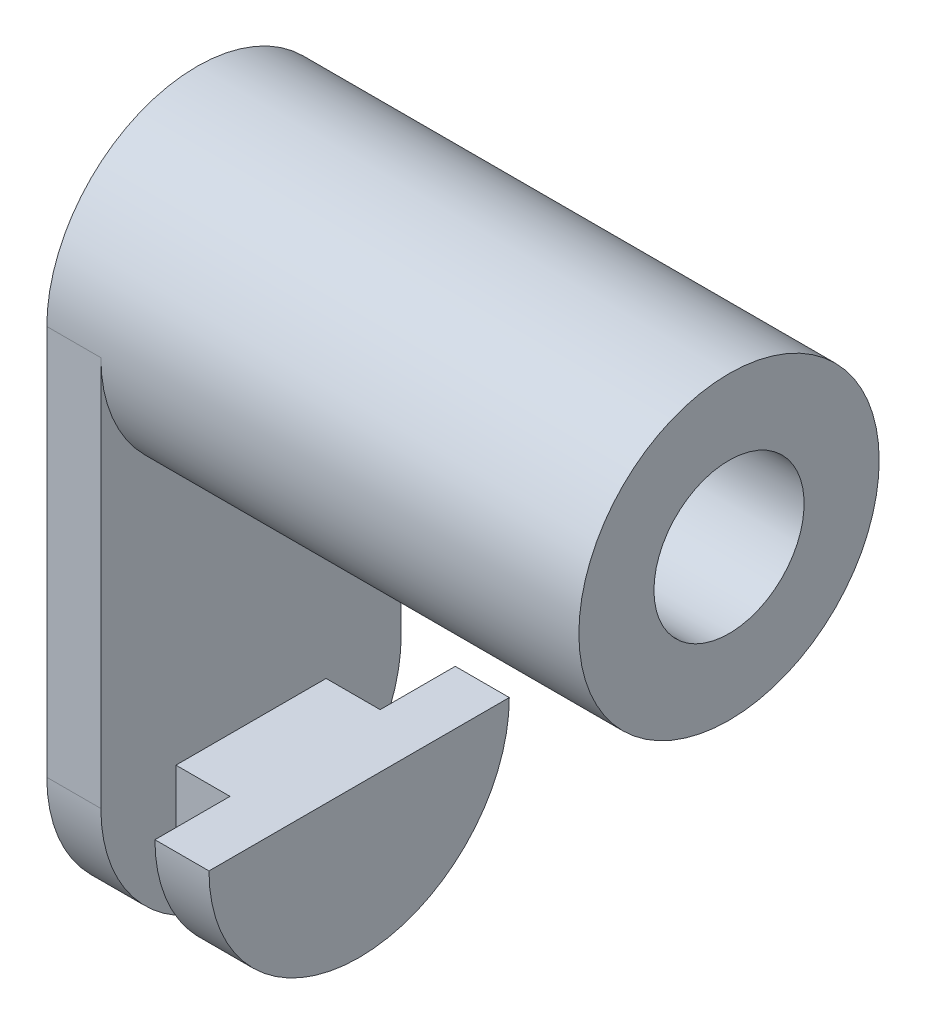
ISO-10303-21;
HEADER;
FILE_DESCRIPTION(('STEP AP214'),'2;1');
FILE_NAME('part.step','',(''),(''),'','','');
FILE_SCHEMA(('AUTOMOTIVE_DESIGN { 1 0 10303 214 1 1 1 1 }'));
ENDSEC;
DATA;
#1=APPLICATION_CONTEXT('core data for automotive mechanical design processes');
#2=APPLICATION_PROTOCOL_DEFINITION('international standard','automotive_design',2000,#1);
#3=PRODUCT_CONTEXT('',#1,'mechanical');
#4=PRODUCT('Part','Part','',(#3));
#5=PRODUCT_RELATED_PRODUCT_CATEGORY('part','',(#4));
#6=PRODUCT_DEFINITION_FORMATION('','',#4);
#7=PRODUCT_DEFINITION_CONTEXT('part definition',#1,'design');
#8=PRODUCT_DEFINITION('design','',#6,#7);
#9=PRODUCT_DEFINITION_SHAPE('','',#8);
#10=(LENGTH_UNIT() NAMED_UNIT(*) SI_UNIT(.MILLI.,.METRE.));
#11=(NAMED_UNIT(*) PLANE_ANGLE_UNIT() SI_UNIT($,.RADIAN.));
#12=(NAMED_UNIT(*) SI_UNIT($,.STERADIAN.) SOLID_ANGLE_UNIT());
#13=UNCERTAINTY_MEASURE_WITH_UNIT(LENGTH_MEASURE(1.E-05),#10,'distance_accuracy_value','');
#14=(GEOMETRIC_REPRESENTATION_CONTEXT(3) GLOBAL_UNCERTAINTY_ASSIGNED_CONTEXT((#13)) GLOBAL_UNIT_ASSIGNED_CONTEXT((#10,
#11,#12)) REPRESENTATION_CONTEXT('',''));
#15=CARTESIAN_POINT('',(0.,0.,0.));
#16=DIRECTION('',(0.,0.,1.));
#17=DIRECTION('',(1.,0.,0.));
#18=AXIS2_PLACEMENT_3D('',#15,#16,#17);
#19=CARTESIAN_POINT('',(0.,0.,0.));
#20=DIRECTION('',(1.,0.,0.));
#21=DIRECTION('',(0.,0.,-1.));
#22=AXIS2_PLACEMENT_3D('',#19,#20,#21);
#23=PLANE('',#22);
#24=DIRECTION('',(0.,-1.,0.));
#25=VECTOR('',#24,1.);
#26=CARTESIAN_POINT('',(0.,0.,-6.35));
#27=LINE('',#26,#25);
#28=CARTESIAN_POINT('',(0.,0.,-6.35));
#29=VERTEX_POINT('',#28);
#30=CARTESIAN_POINT('',(0.,-16.51,-6.35));
#31=VERTEX_POINT('',#30);
#32=EDGE_CURVE('E206',#29,#31,#27,.T.);
#33=ORIENTED_EDGE('',*,*,#32,.T.);
#34=CARTESIAN_POINT('',(0.,-16.51,0.));
#35=DIRECTION('',(1.,0.,0.));
#36=DIRECTION('',(0.,0.,-1.));
#37=AXIS2_PLACEMENT_3D('',#34,#35,#36);
#38=CIRCLE('',#37,6.35);
#39=CARTESIAN_POINT('',(0.,-22.86,0.));
#40=VERTEX_POINT('',#39);
#41=EDGE_CURVE('E164',#31,#40,#38,.F.);
#42=ORIENTED_EDGE('',*,*,#41,.T.);
#43=CARTESIAN_POINT('',(0.,-16.51,0.));
#44=DIRECTION('',(1.,0.,0.));
#45=DIRECTION('',(0.,0.,-1.));
#46=AXIS2_PLACEMENT_3D('',#43,#44,#45);
#47=CIRCLE('',#46,6.35);
#48=CARTESIAN_POINT('',(0.,-16.51,6.35));
#49=VERTEX_POINT('',#48);
#50=EDGE_CURVE('E65',#40,#49,#47,.F.);
#51=ORIENTED_EDGE('',*,*,#50,.T.);
#52=DIRECTION('',(0.,-1.,0.));
#53=VECTOR('',#52,1.);
#54=CARTESIAN_POINT('',(0.,0.,6.35));
#55=LINE('',#54,#53);
#56=CARTESIAN_POINT('',(0.,0.,6.35));
#57=VERTEX_POINT('',#56);
#58=EDGE_CURVE('E200',#57,#49,#55,.T.);
#59=ORIENTED_EDGE('',*,*,#58,.F.);
#60=CARTESIAN_POINT('',(0.,0.,0.));
#61=DIRECTION('',(1.,0.,0.));
#62=DIRECTION('',(0.,0.,-1.));
#63=AXIS2_PLACEMENT_3D('',#60,#61,#62);
#64=CIRCLE('',#63,6.35);
#65=EDGE_CURVE('E218',#29,#57,#64,.T.);
#66=ORIENTED_EDGE('',*,*,#65,.F.);
#67=EDGE_LOOP('',(#33,#42,#51,#59,#66));
#68=FACE_BOUND('',#67,.T.);
#69=CARTESIAN_POINT('',(0.,0.,0.));
#70=DIRECTION('',(1.,0.,0.));
#71=DIRECTION('',(0.,0.,-1.));
#72=AXIS2_PLACEMENT_3D('',#69,#70,#71);
#73=CIRCLE('',#72,3.);
#74=CARTESIAN_POINT('',(0.,0.,-3.));
#75=VERTEX_POINT('',#74);
#76=EDGE_CURVE('E214',#75,#75,#73,.T.);
#77=ORIENTED_EDGE('',*,*,#76,.T.);
#78=EDGE_LOOP('',(#77));
#79=FACE_BOUND('',#78,.T.);
#80=ADVANCED_FACE('F41',(#68,#79),#23,.F.);
#81=CARTESIAN_POINT('',(2.286,0.,-6.35));
#82=DIRECTION('',(1.,0.,0.));
#83=DIRECTION('',(0.,0.,-1.));
#84=AXIS2_PLACEMENT_3D('',#81,#82,#83);
#85=PLANE('',#84);
#86=DIRECTION('',(0.,1.,0.));
#87=VECTOR('',#86,1.);
#88=CARTESIAN_POINT('',(2.286,0.,-3.175));
#89=LINE('',#88,#87);
#90=CARTESIAN_POINT('',(2.286,-22.0092613140312,-3.175));
#91=VERTEX_POINT('',#90);
#92=CARTESIAN_POINT('',(2.286,-16.51,-3.175));
#93=VERTEX_POINT('',#92);
#94=EDGE_CURVE('E191',#91,#93,#89,.T.);
#95=ORIENTED_EDGE('',*,*,#94,.F.);
#96=CARTESIAN_POINT('',(2.286,-16.51,0.));
#97=DIRECTION('',(1.,0.,0.));
#98=DIRECTION('',(0.,0.,-1.));
#99=AXIS2_PLACEMENT_3D('',#96,#97,#98);
#100=CIRCLE('',#99,6.35);
#101=CARTESIAN_POINT('',(2.286,-16.51,-6.35));
#102=VERTEX_POINT('',#101);
#103=EDGE_CURVE('E159',#91,#102,#100,.T.);
#104=ORIENTED_EDGE('',*,*,#103,.T.);
#105=DIRECTION('',(0.,1.,0.));
#106=VECTOR('',#105,1.);
#107=CARTESIAN_POINT('',(2.286,0.,-6.35));
#108=LINE('',#107,#106);
#109=CARTESIAN_POINT('',(2.286,0.,-6.35));
#110=VERTEX_POINT('',#109);
#111=EDGE_CURVE('E209',#102,#110,#108,.T.);
#112=ORIENTED_EDGE('',*,*,#111,.T.);
#113=CARTESIAN_POINT('',(2.286,0.,0.));
#114=DIRECTION('',(1.,0.,0.));
#115=DIRECTION('',(0.,0.,-1.));
#116=AXIS2_PLACEMENT_3D('',#113,#114,#115);
#117=CIRCLE('',#116,6.35);
#118=CARTESIAN_POINT('',(2.28600000000001,0.,6.35));
#119=VERTEX_POINT('',#118);
#120=EDGE_CURVE('E211',#119,#110,#117,.T.);
#121=ORIENTED_EDGE('',*,*,#120,.F.);
#122=DIRECTION('',(0.,1.,0.));
#123=VECTOR('',#122,1.);
#124=CARTESIAN_POINT('',(2.286,0.,6.35));
#125=LINE('',#124,#123);
#126=CARTESIAN_POINT('',(2.286,-16.51,6.35));
#127=VERTEX_POINT('',#126);
#128=EDGE_CURVE('E179',#127,#119,#125,.T.);
#129=ORIENTED_EDGE('',*,*,#128,.F.);
#130=CARTESIAN_POINT('',(2.286,-16.51,0.));
#131=DIRECTION('',(1.,0.,0.));
#132=DIRECTION('',(0.,0.,-1.));
#133=AXIS2_PLACEMENT_3D('',#130,#131,#132);
#134=CIRCLE('',#133,6.35);
#135=CARTESIAN_POINT('',(2.286,-22.0092613140312,3.175));
#136=VERTEX_POINT('',#135);
#137=EDGE_CURVE('E152',#127,#136,#134,.T.);
#138=ORIENTED_EDGE('',*,*,#137,.T.);
#139=DIRECTION('',(0.,1.,0.));
#140=VECTOR('',#139,1.);
#141=CARTESIAN_POINT('',(2.286,0.,3.175));
#142=LINE('',#141,#140);
#143=CARTESIAN_POINT('',(2.286,-16.51,3.175));
#144=VERTEX_POINT('',#143);
#145=EDGE_CURVE('E177',#136,#144,#142,.T.);
#146=ORIENTED_EDGE('',*,*,#145,.T.);
#147=DIRECTION('',(0.,0.,1.));
#148=VECTOR('',#147,1.);
#149=CARTESIAN_POINT('',(2.286,-16.51,-3.175));
#150=LINE('',#149,#148);
#151=EDGE_CURVE('E195',#93,#144,#150,.T.);
#152=ORIENTED_EDGE('',*,*,#151,.F.);
#153=EDGE_LOOP('',(#95,#104,#112,#121,#129,#138,#146,#152));
#154=FACE_BOUND('',#153,.T.);
#155=ADVANCED_FACE('F175',(#154),#85,.T.);
#156=CARTESIAN_POINT('',(22.5,0.,0.));
#157=DIRECTION('',(-1.,0.,0.));
#158=DIRECTION('',(0.,0.,1.));
#159=AXIS2_PLACEMENT_3D('',#156,#157,#158);
#160=CYLINDRICAL_SURFACE('',#159,6.35);
#161=CARTESIAN_POINT('',(22.5,0.,0.));
#162=DIRECTION('',(1.,0.,0.));
#163=DIRECTION('',(0.,0.,-1.));
#164=AXIS2_PLACEMENT_3D('',#161,#162,#163);
#165=CIRCLE('',#164,6.35);
#166=CARTESIAN_POINT('',(22.5,0.,-6.35));
#167=VERTEX_POINT('',#166);
#168=EDGE_CURVE('E224',#167,#167,#165,.T.);
#169=ORIENTED_EDGE('',*,*,#168,.F.);
#170=EDGE_LOOP('',(#169));
#171=FACE_BOUND('',#170,.T.);
#172=DIRECTION('',(1.,0.,0.));
#173=VECTOR('',#172,1.);
#174=CARTESIAN_POINT('',(0.,0.,-6.35));
#175=LINE('',#174,#173);
#176=EDGE_CURVE('E203',#29,#110,#175,.T.);
#177=ORIENTED_EDGE('',*,*,#176,.F.);
#178=ORIENTED_EDGE('',*,*,#65,.T.);
#179=DIRECTION('',(1.,0.,0.));
#180=VECTOR('',#179,1.);
#181=CARTESIAN_POINT('',(0.,0.,6.35));
#182=LINE('',#181,#180);
#183=EDGE_CURVE('E197',#57,#119,#182,.T.);
#184=ORIENTED_EDGE('',*,*,#183,.T.);
#185=ORIENTED_EDGE('',*,*,#120,.T.);
#186=EDGE_LOOP('',(#177,#178,#184,#185));
#187=FACE_BOUND('',#186,.T.);
#188=ADVANCED_FACE('F253',(#171,#187),#160,.T.);
#189=CARTESIAN_POINT('',(7.,0.,0.));
#190=DIRECTION('',(-1.,0.,0.));
#191=DIRECTION('',(0.,0.,1.));
#192=AXIS2_PLACEMENT_3D('',#189,#190,#191);
#193=CYLINDRICAL_SURFACE('',#192,3.);
#194=ORIENTED_EDGE('',*,*,#76,.F.);
#195=EDGE_LOOP('',(#194));
#196=FACE_BOUND('',#195,.T.);
#197=CARTESIAN_POINT('',(7.,0.,0.));
#198=DIRECTION('',(1.,0.,0.));
#199=DIRECTION('',(0.,0.,-1.));
#200=AXIS2_PLACEMENT_3D('',#197,#198,#199);
#201=CIRCLE('',#200,3.);
#202=CARTESIAN_POINT('',(7.,0.,-3.));
#203=VERTEX_POINT('',#202);
#204=EDGE_CURVE('E215',#203,#203,#201,.T.);
#205=ORIENTED_EDGE('',*,*,#204,.T.);
#206=EDGE_LOOP('',(#205));
#207=FACE_BOUND('',#206,.T.);
#208=ADVANCED_FACE('F279',(#196,#207),#193,.F.);
#209=CARTESIAN_POINT('',(22.5,0.,0.));
#210=DIRECTION('',(-1.,0.,0.));
#211=DIRECTION('',(0.,0.,1.));
#212=AXIS2_PLACEMENT_3D('',#209,#210,#211);
#213=CYLINDRICAL_SURFACE('',#212,3.175);
#214=CARTESIAN_POINT('',(7.,0.,0.));
#215=DIRECTION('',(1.,0.,0.));
#216=DIRECTION('',(0.,0.,-1.));
#217=AXIS2_PLACEMENT_3D('',#214,#215,#216);
#218=CIRCLE('',#217,3.175);
#219=CARTESIAN_POINT('',(7.,0.,3.175));
#220=VERTEX_POINT('',#219);
#221=EDGE_CURVE('E227',#220,#220,#218,.T.);
#222=CARTESIAN_POINT('',(22.5,0.,0.));
#223=DIRECTION('',(1.,0.,0.));
#224=DIRECTION('',(0.,0.,-1.));
#225=AXIS2_PLACEMENT_3D('',#222,#223,#224);
#226=CIRCLE('',#225,3.175);
#227=CARTESIAN_POINT('',(22.5,0.,3.175));
#228=VERTEX_POINT('',#227);
#229=EDGE_CURVE('E221',#228,#228,#226,.T.);
#230=CARTESIAN_POINT('',(7.,0.,3.175));
#231=CARTESIAN_POINT('',(7.16145833333333,0.,3.175));
#232=CARTESIAN_POINT('',(7.32291666666666,0.,3.175));
#233=CARTESIAN_POINT('',(7.64583333333333,0.,3.175));
#234=CARTESIAN_POINT('',(7.80729166666666,0.,3.175));
#235=CARTESIAN_POINT('',(8.13020833333333,0.,3.175));
#236=CARTESIAN_POINT('',(8.29166666666666,0.,3.175));
#237=CARTESIAN_POINT('',(8.61458333333333,0.,3.175));
#238=CARTESIAN_POINT('',(8.77604166666666,0.,3.175));
#239=CARTESIAN_POINT('',(9.09895833333333,0.,3.175));
#240=CARTESIAN_POINT('',(9.26041666666666,0.,3.175));
#241=CARTESIAN_POINT('',(9.58333333333333,0.,3.175));
#242=CARTESIAN_POINT('',(9.74479166666667,0.,3.175));
#243=CARTESIAN_POINT('',(10.0677083333333,0.,3.175));
#244=CARTESIAN_POINT('',(10.2291666666667,0.,3.175));
#245=CARTESIAN_POINT('',(10.5520833333333,0.,3.175));
#246=CARTESIAN_POINT('',(10.7135416666667,0.,3.175));
#247=CARTESIAN_POINT('',(11.0364583333333,0.,3.175));
#248=CARTESIAN_POINT('',(11.1979166666667,0.,3.175));
#249=CARTESIAN_POINT('',(11.5208333333333,0.,3.175));
#250=CARTESIAN_POINT('',(11.6822916666667,0.,3.175));
#251=CARTESIAN_POINT('',(12.0052083333333,0.,3.175));
#252=CARTESIAN_POINT('',(12.1666666666667,0.,3.175));
#253=CARTESIAN_POINT('',(12.4895833333333,0.,3.175));
#254=CARTESIAN_POINT('',(12.6510416666667,0.,3.175));
#255=CARTESIAN_POINT('',(12.9739583333333,0.,3.175));
#256=CARTESIAN_POINT('',(13.1354166666667,0.,3.175));
#257=CARTESIAN_POINT('',(13.4583333333333,0.,3.175));
#258=CARTESIAN_POINT('',(13.6197916666667,0.,3.175));
#259=CARTESIAN_POINT('',(13.9427083333333,0.,3.175));
#260=CARTESIAN_POINT('',(14.1041666666667,0.,3.175));
#261=CARTESIAN_POINT('',(14.4270833333333,0.,3.175));
#262=CARTESIAN_POINT('',(14.5885416666667,0.,3.175));
#263=CARTESIAN_POINT('',(14.9114583333333,0.,3.175));
#264=CARTESIAN_POINT('',(15.0729166666667,0.,3.175));
#265=CARTESIAN_POINT('',(15.3958333333333,0.,3.175));
#266=CARTESIAN_POINT('',(15.5572916666667,0.,3.175));
#267=CARTESIAN_POINT('',(15.8802083333333,0.,3.175));
#268=CARTESIAN_POINT('',(16.0416666666667,0.,3.175));
#269=CARTESIAN_POINT('',(16.3645833333333,0.,3.175));
#270=CARTESIAN_POINT('',(16.5260416666667,0.,3.175));
#271=CARTESIAN_POINT('',(16.8489583333333,0.,3.175));
#272=CARTESIAN_POINT('',(17.0104166666667,0.,3.175));
#273=CARTESIAN_POINT('',(17.3333333333333,0.,3.175));
#274=CARTESIAN_POINT('',(17.4947916666667,0.,3.175));
#275=CARTESIAN_POINT('',(17.8177083333333,0.,3.175));
#276=CARTESIAN_POINT('',(17.9791666666667,0.,3.175));
#277=CARTESIAN_POINT('',(18.3020833333333,0.,3.175));
#278=CARTESIAN_POINT('',(18.4635416666667,0.,3.175));
#279=CARTESIAN_POINT('',(18.7864583333333,0.,3.175));
#280=CARTESIAN_POINT('',(18.9479166666667,0.,3.175));
#281=CARTESIAN_POINT('',(19.2708333333333,0.,3.175));
#282=CARTESIAN_POINT('',(19.4322916666667,0.,3.175));
#283=CARTESIAN_POINT('',(19.7552083333333,0.,3.175));
#284=CARTESIAN_POINT('',(19.9166666666667,0.,3.175));
#285=CARTESIAN_POINT('',(20.2395833333333,0.,3.175));
#286=CARTESIAN_POINT('',(20.4010416666667,0.,3.175));
#287=CARTESIAN_POINT('',(20.7239583333333,0.,3.175));
#288=CARTESIAN_POINT('',(20.8854166666667,0.,3.175));
#289=CARTESIAN_POINT('',(21.2083333333333,0.,3.175));
#290=CARTESIAN_POINT('',(21.3697916666667,0.,3.175));
#291=CARTESIAN_POINT('',(21.6927083333333,0.,3.175));
#292=CARTESIAN_POINT('',(21.8541666666667,0.,3.175));
#293=CARTESIAN_POINT('',(22.1770833333333,0.,3.175));
#294=CARTESIAN_POINT('',(22.3385416666667,0.,3.175));
#295=CARTESIAN_POINT('',(22.5,0.,3.175));
#296=B_SPLINE_CURVE_WITH_KNOTS('',3,(#230,#231,#232,#233,#234,#235,#236,#237,#238,#239,#240,
#241,#242,#243,#244,#245,#246,#247,#248,#249,#250,#251,#252,#253,#254,#255,#256,#257,#258,#259,
#260,#261,#262,#263,#264,#265,#266,#267,#268,#269,#270,#271,#272,#273,#274,#275,#276,#277,#278,
#279,#280,#281,#282,#283,#284,#285,#286,#287,#288,#289,#290,#291,#292,#293,#294,#295),
.UNSPECIFIED.,.F.,.F.,(4,2,2,2,2,2,2,2,2,2,2,2,2,2,2,2,2,2,2,2,2,2,2,2,2,2,2,2,2,2,2,2,4),(0.,
0.484375,0.968750000000001,1.453125,1.9375,2.421875,2.90625,3.390625,3.875,4.359375,4.84375,
5.328125,5.8125,6.296875,6.78125,7.265625,7.75,8.234375,8.71875,9.203125,9.6875,10.171875,
10.65625,11.140625,11.625,12.109375,12.59375,13.078125,13.5625,14.046875,14.53125,15.015625,
15.5),.UNSPECIFIED.);
#297=EDGE_CURVE('BSEAM281',#220,#228,#296,.T.);
#298=ORIENTED_EDGE('',*,*,#221,.F.);
#299=ORIENTED_EDGE('',*,*,#229,.T.);
#300=ORIENTED_EDGE('',*,*,#297,.T.);
#301=ORIENTED_EDGE('',*,*,#297,.F.);
#302=EDGE_LOOP('',(#298,#300,#299,#301));
#303=FACE_BOUND('',#302,.T.);
#304=ADVANCED_FACE('F281',(#303),#213,.F.);
#305=CARTESIAN_POINT('',(22.5,0.,0.));
#306=DIRECTION('',(1.,0.,0.));
#307=DIRECTION('',(0.,0.,-1.));
#308=AXIS2_PLACEMENT_3D('',#305,#306,#307);
#309=PLANE('',#308);
#310=ORIENTED_EDGE('',*,*,#229,.F.);
#311=EDGE_LOOP('',(#310));
#312=FACE_BOUND('',#311,.T.);
#313=ORIENTED_EDGE('',*,*,#168,.T.);
#314=EDGE_LOOP('',(#313));
#315=FACE_BOUND('',#314,.T.);
#316=ADVANCED_FACE('F275',(#312,#315),#309,.T.);
#317=CARTESIAN_POINT('',(7.,0.,0.));
#318=DIRECTION('',(1.,0.,0.));
#319=DIRECTION('',(0.,0.,-1.));
#320=AXIS2_PLACEMENT_3D('',#317,#318,#319);
#321=PLANE('',#320);
#322=ORIENTED_EDGE('',*,*,#204,.F.);
#323=EDGE_LOOP('',(#322));
#324=FACE_BOUND('',#323,.T.);
#325=ORIENTED_EDGE('',*,*,#221,.T.);
#326=EDGE_LOOP('',(#325));
#327=FACE_BOUND('',#326,.T.);
#328=ADVANCED_FACE('F264',(#324,#327),#321,.T.);
#329=CARTESIAN_POINT('',(0.,0.,-6.35));
#330=DIRECTION('',(0.,0.,1.));
#331=DIRECTION('',(1.,0.,0.));
#332=AXIS2_PLACEMENT_3D('',#329,#330,#331);
#333=PLANE('',#332);
#334=ORIENTED_EDGE('',*,*,#111,.F.);
#335=DIRECTION('',(1.,0.,0.));
#336=VECTOR('',#335,1.);
#337=CARTESIAN_POINT('',(0.,-16.51,-6.35));
#338=LINE('',#337,#336);
#339=EDGE_CURVE('E161',#102,#31,#338,.F.);
#340=ORIENTED_EDGE('',*,*,#339,.T.);
#341=ORIENTED_EDGE('',*,*,#32,.F.);
#342=ORIENTED_EDGE('',*,*,#176,.T.);
#343=EDGE_LOOP('',(#334,#340,#341,#342));
#344=FACE_BOUND('',#343,.T.);
#345=ADVANCED_FACE('F251',(#344),#333,.F.);
#346=CARTESIAN_POINT('',(0.,0.,6.35));
#347=DIRECTION('',(0.,0.,1.));
#348=DIRECTION('',(1.,0.,0.));
#349=AXIS2_PLACEMENT_3D('',#346,#347,#348);
#350=PLANE('',#349);
#351=ORIENTED_EDGE('',*,*,#58,.T.);
#352=DIRECTION('',(1.,0.,0.));
#353=VECTOR('',#352,1.);
#354=CARTESIAN_POINT('',(0.,-16.51,6.35));
#355=LINE('',#354,#353);
#356=EDGE_CURVE('E11',#49,#127,#355,.T.);
#357=ORIENTED_EDGE('',*,*,#356,.T.);
#358=ORIENTED_EDGE('',*,*,#128,.T.);
#359=ORIENTED_EDGE('',*,*,#183,.F.);
#360=EDGE_LOOP('',(#351,#357,#358,#359));
#361=FACE_BOUND('',#360,.T.);
#362=ADVANCED_FACE('F256',(#361),#350,.T.);
#363=CARTESIAN_POINT('',(0.,-16.51,-3.175));
#364=DIRECTION('',(0.,-1.,0.));
#365=DIRECTION('',(1.,0.,0.));
#366=AXIS2_PLACEMENT_3D('',#363,#364,#365);
#367=PLANE('',#366);
#368=ORIENTED_EDGE('',*,*,#151,.T.);
#369=DIRECTION('',(1.,0.,0.));
#370=VECTOR('',#369,1.);
#371=CARTESIAN_POINT('',(0.,-16.51,3.175));
#372=LINE('',#371,#370);
#373=CARTESIAN_POINT('',(4.572,-16.51,3.175));
#374=VERTEX_POINT('',#373);
#375=EDGE_CURVE('E182',#144,#374,#372,.T.);
#376=ORIENTED_EDGE('',*,*,#375,.T.);
#377=DIRECTION('',(0.,0.,1.));
#378=VECTOR('',#377,1.);
#379=CARTESIAN_POINT('',(4.572,-16.51,-6.35));
#380=LINE('',#379,#378);
#381=CARTESIAN_POINT('',(4.572,-16.51,6.35));
#382=VERTEX_POINT('',#381);
#383=EDGE_CURVE('E136',#374,#382,#380,.T.);
#384=ORIENTED_EDGE('',*,*,#383,.T.);
#385=DIRECTION('',(1.,0.,0.));
#386=VECTOR('',#385,1.);
#387=CARTESIAN_POINT('',(0.,-16.51,6.35));
#388=LINE('',#387,#386);
#389=CARTESIAN_POINT('',(6.858,-16.51,6.35));
#390=VERTEX_POINT('',#389);
#391=EDGE_CURVE('E141',#382,#390,#388,.T.);
#392=ORIENTED_EDGE('',*,*,#391,.T.);
#393=DIRECTION('',(0.,0.,1.));
#394=VECTOR('',#393,1.);
#395=CARTESIAN_POINT('',(6.858,-16.51,-6.35));
#396=LINE('',#395,#394);
#397=CARTESIAN_POINT('',(6.858,-16.51,-6.35));
#398=VERTEX_POINT('',#397);
#399=EDGE_CURVE('E126',#398,#390,#396,.T.);
#400=ORIENTED_EDGE('',*,*,#399,.F.);
#401=DIRECTION('',(1.,0.,0.));
#402=VECTOR('',#401,1.);
#403=CARTESIAN_POINT('',(0.,-16.51,-6.35));
#404=LINE('',#403,#402);
#405=CARTESIAN_POINT('',(4.572,-16.51,-6.35));
#406=VERTEX_POINT('',#405);
#407=EDGE_CURVE('E137',#406,#398,#404,.T.);
#408=ORIENTED_EDGE('',*,*,#407,.F.);
#409=CARTESIAN_POINT('',(4.572,-16.51,-3.175));
#410=VERTEX_POINT('',#409);
#411=EDGE_CURVE('E186',#406,#410,#380,.T.);
#412=ORIENTED_EDGE('',*,*,#411,.T.);
#413=DIRECTION('',(1.,0.,0.));
#414=VECTOR('',#413,1.);
#415=CARTESIAN_POINT('',(0.,-16.51,-3.175));
#416=LINE('',#415,#414);
#417=EDGE_CURVE('E184',#93,#410,#416,.T.);
#418=ORIENTED_EDGE('',*,*,#417,.F.);
#419=EDGE_LOOP('',(#368,#376,#384,#392,#400,#408,#412,#418));
#420=FACE_BOUND('',#419,.T.);
#421=ADVANCED_FACE('F143',(#420),#367,.F.);
#422=CARTESIAN_POINT('',(0.,0.,-3.175));
#423=DIRECTION('',(0.,0.,1.));
#424=DIRECTION('',(1.,0.,0.));
#425=AXIS2_PLACEMENT_3D('',#422,#423,#424);
#426=PLANE('',#425);
#427=DIRECTION('',(0.,1.,0.));
#428=VECTOR('',#427,1.);
#429=CARTESIAN_POINT('',(4.572,0.,-3.175));
#430=LINE('',#429,#428);
#431=CARTESIAN_POINT('',(4.572,-22.0092613140312,-3.175));
#432=VERTEX_POINT('',#431);
#433=EDGE_CURVE('E193',#432,#410,#430,.T.);
#434=ORIENTED_EDGE('',*,*,#433,.F.);
#435=DIRECTION('',(-1.,0.,0.));
#436=VECTOR('',#435,1.);
#437=CARTESIAN_POINT('',(4.572,-22.0092613140312,-3.175));
#438=LINE('',#437,#436);
#439=EDGE_CURVE('E150',#432,#91,#438,.T.);
#440=ORIENTED_EDGE('',*,*,#439,.T.);
#441=ORIENTED_EDGE('',*,*,#94,.T.);
#442=ORIENTED_EDGE('',*,*,#417,.T.);
#443=EDGE_LOOP('',(#434,#440,#441,#442));
#444=FACE_BOUND('',#443,.T.);
#445=ADVANCED_FACE('F238',(#444),#426,.F.);
#446=CARTESIAN_POINT('',(0.,0.,3.175));
#447=DIRECTION('',(0.,0.,1.));
#448=DIRECTION('',(1.,0.,0.));
#449=AXIS2_PLACEMENT_3D('',#446,#447,#448);
#450=PLANE('',#449);
#451=DIRECTION('',(1.,0.,0.));
#452=VECTOR('',#451,1.);
#453=CARTESIAN_POINT('',(2.286,-22.0092613140312,3.175));
#454=LINE('',#453,#452);
#455=CARTESIAN_POINT('',(4.572,-22.0092613140312,3.175));
#456=VERTEX_POINT('',#455);
#457=EDGE_CURVE('E57',#136,#456,#454,.T.);
#458=ORIENTED_EDGE('',*,*,#457,.T.);
#459=DIRECTION('',(0.,1.,0.));
#460=VECTOR('',#459,1.);
#461=CARTESIAN_POINT('',(4.572,0.,3.175));
#462=LINE('',#461,#460);
#463=EDGE_CURVE('E169',#456,#374,#462,.T.);
#464=ORIENTED_EDGE('',*,*,#463,.T.);
#465=ORIENTED_EDGE('',*,*,#375,.F.);
#466=ORIENTED_EDGE('',*,*,#145,.F.);
#467=EDGE_LOOP('',(#458,#464,#465,#466));
#468=FACE_BOUND('',#467,.T.);
#469=ADVANCED_FACE('F181',(#468),#450,.T.);
#470=CARTESIAN_POINT('',(4.572,0.,-6.35));
#471=DIRECTION('',(1.,0.,0.));
#472=DIRECTION('',(0.,0.,-1.));
#473=AXIS2_PLACEMENT_3D('',#470,#471,#472);
#474=PLANE('',#473);
#475=ORIENTED_EDGE('',*,*,#411,.F.);
#476=CARTESIAN_POINT('',(4.572,-16.51,0.));
#477=DIRECTION('',(1.,0.,0.));
#478=DIRECTION('',(0.,0.,-1.));
#479=AXIS2_PLACEMENT_3D('',#476,#477,#478);
#480=CIRCLE('',#479,6.35);
#481=EDGE_CURVE('E154',#406,#432,#480,.F.);
#482=ORIENTED_EDGE('',*,*,#481,.T.);
#483=ORIENTED_EDGE('',*,*,#433,.T.);
#484=EDGE_LOOP('',(#475,#482,#483));
#485=FACE_BOUND('',#484,.T.);
#486=ADVANCED_FACE('F234',(#485),#474,.F.);
#487=ORIENTED_EDGE('',*,*,#463,.F.);
#488=CARTESIAN_POINT('',(4.572,-16.51,0.));
#489=DIRECTION('',(1.,0.,0.));
#490=DIRECTION('',(0.,0.,-1.));
#491=AXIS2_PLACEMENT_3D('',#488,#489,#490);
#492=CIRCLE('',#491,6.35);
#493=EDGE_CURVE('E50',#456,#382,#492,.F.);
#494=ORIENTED_EDGE('',*,*,#493,.T.);
#495=ORIENTED_EDGE('',*,*,#383,.F.);
#496=EDGE_LOOP('',(#487,#494,#495));
#497=FACE_BOUND('',#496,.T.);
#498=ADVANCED_FACE('F168',(#497),#474,.F.);
#499=CARTESIAN_POINT('',(6.858,0.,-6.35));
#500=DIRECTION('',(-1.,0.,0.));
#501=DIRECTION('',(0.,-1.,0.));
#502=AXIS2_PLACEMENT_3D('',#499,#500,#501);
#503=PLANE('',#502);
#504=CARTESIAN_POINT('',(6.858,-16.51,0.));
#505=DIRECTION('',(-1.,0.,0.));
#506=DIRECTION('',(0.,-1.,0.));
#507=AXIS2_PLACEMENT_3D('',#504,#505,#506);
#508=CIRCLE('',#507,6.35);
#509=CARTESIAN_POINT('',(6.858,-22.86,0.));
#510=VERTEX_POINT('',#509);
#511=EDGE_CURVE('E130',#390,#510,#508,.F.);
#512=ORIENTED_EDGE('',*,*,#511,.T.);
#513=CARTESIAN_POINT('',(6.858,-16.51,0.));
#514=DIRECTION('',(-1.,0.,0.));
#515=DIRECTION('',(0.,-1.,0.));
#516=AXIS2_PLACEMENT_3D('',#513,#514,#515);
#517=CIRCLE('',#516,6.35);
#518=EDGE_CURVE('E132',#510,#398,#517,.F.);
#519=ORIENTED_EDGE('',*,*,#518,.T.);
#520=ORIENTED_EDGE('',*,*,#399,.T.);
#521=EDGE_LOOP('',(#512,#519,#520));
#522=FACE_BOUND('',#521,.T.);
#523=ADVANCED_FACE('F128',(#522),#503,.F.);
#524=CARTESIAN_POINT('',(0.,-16.51,0.));
#525=DIRECTION('',(1.,0.,0.));
#526=DIRECTION('',(0.,0.,-1.));
#527=AXIS2_PLACEMENT_3D('',#524,#525,#526);
#528=CYLINDRICAL_SURFACE('',#527,6.35);
#529=DIRECTION('',(1.,0.,0.));
#530=VECTOR('',#529,1.);
#531=CARTESIAN_POINT('',(0.,-22.86,0.));
#532=LINE('',#531,#530);
#533=EDGE_CURVE('E45',#510,#40,#532,.F.);
#534=ORIENTED_EDGE('',*,*,#533,.F.);
#535=ORIENTED_EDGE('',*,*,#511,.F.);
#536=ORIENTED_EDGE('',*,*,#391,.F.);
#537=ORIENTED_EDGE('',*,*,#493,.F.);
#538=ORIENTED_EDGE('',*,*,#457,.F.);
#539=ORIENTED_EDGE('',*,*,#137,.F.);
#540=ORIENTED_EDGE('',*,*,#356,.F.);
#541=ORIENTED_EDGE('',*,*,#50,.F.);
#542=EDGE_LOOP('',(#534,#535,#536,#537,#538,#539,#540,#541));
#543=FACE_BOUND('',#542,.T.);
#544=ADVANCED_FACE('F43',(#543),#528,.T.);
#545=CARTESIAN_POINT('',(0.,-16.51,0.));
#546=DIRECTION('',(-1.,0.,0.));
#547=DIRECTION('',(0.,0.,1.));
#548=AXIS2_PLACEMENT_3D('',#545,#546,#547);
#549=CYLINDRICAL_SURFACE('',#548,6.35);
#550=ORIENTED_EDGE('',*,*,#103,.F.);
#551=ORIENTED_EDGE('',*,*,#439,.F.);
#552=ORIENTED_EDGE('',*,*,#481,.F.);
#553=ORIENTED_EDGE('',*,*,#407,.T.);
#554=ORIENTED_EDGE('',*,*,#518,.F.);
#555=ORIENTED_EDGE('',*,*,#533,.T.);
#556=ORIENTED_EDGE('',*,*,#41,.F.);
#557=ORIENTED_EDGE('',*,*,#339,.F.);
#558=EDGE_LOOP('',(#550,#551,#552,#553,#554,#555,#556,#557));
#559=FACE_BOUND('',#558,.T.);
#560=ADVANCED_FACE('F243',(#559),#549,.T.);
#561=CLOSED_SHELL('',(#80,#155,#188,#208,#304,#316,#328,#345,#362,#421,#445,#469,#486,#498,#523,
#544,#560));
#562=MANIFOLD_SOLID_BREP('B2',#561);
#563=ADVANCED_BREP_SHAPE_REPRESENTATION('',(#18,#562),#14);
#564=SHAPE_DEFINITION_REPRESENTATION(#9,#563);
ENDSEC;
END-ISO-10303-21;
